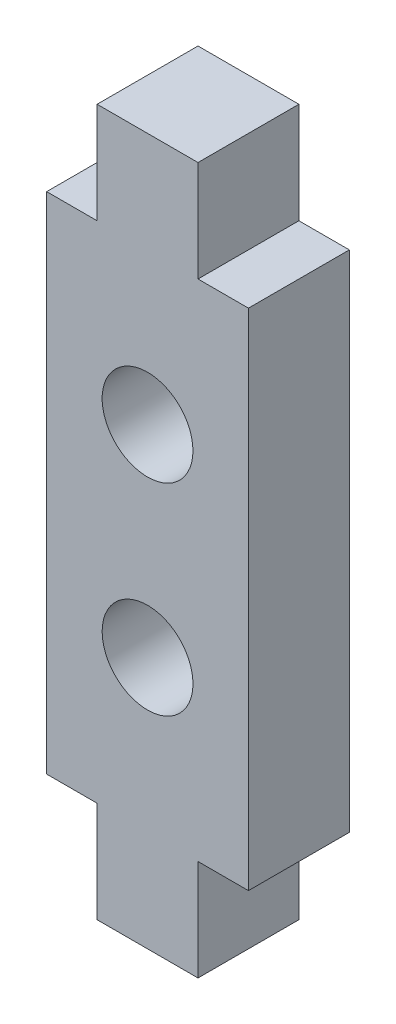
ISO-10303-21;
HEADER;
FILE_DESCRIPTION(('STEP AP214'),'2;1');
FILE_NAME('part.step','',(''),(''),'','','');
FILE_SCHEMA(('AUTOMOTIVE_DESIGN { 1 0 10303 214 1 1 1 1 }'));
ENDSEC;
DATA;
#1=APPLICATION_CONTEXT('core data for automotive mechanical design processes');
#2=APPLICATION_PROTOCOL_DEFINITION('international standard','automotive_design',2000,#1);
#3=PRODUCT_CONTEXT('',#1,'mechanical');
#4=PRODUCT('Part','Part','',(#3));
#5=PRODUCT_RELATED_PRODUCT_CATEGORY('part','',(#4));
#6=PRODUCT_DEFINITION_FORMATION('','',#4);
#7=PRODUCT_DEFINITION_CONTEXT('part definition',#1,'design');
#8=PRODUCT_DEFINITION('design','',#6,#7);
#9=PRODUCT_DEFINITION_SHAPE('','',#8);
#10=(LENGTH_UNIT() NAMED_UNIT(*) SI_UNIT(.MILLI.,.METRE.));
#11=(NAMED_UNIT(*) PLANE_ANGLE_UNIT() SI_UNIT($,.RADIAN.));
#12=(NAMED_UNIT(*) SI_UNIT($,.STERADIAN.) SOLID_ANGLE_UNIT());
#13=UNCERTAINTY_MEASURE_WITH_UNIT(LENGTH_MEASURE(1.E-05),#10,'distance_accuracy_value','');
#14=(GEOMETRIC_REPRESENTATION_CONTEXT(3) GLOBAL_UNCERTAINTY_ASSIGNED_CONTEXT((#13)) GLOBAL_UNIT_ASSIGNED_CONTEXT((#10,
#11,#12)) REPRESENTATION_CONTEXT('',''));
#15=CARTESIAN_POINT('',(0.,0.,0.));
#16=DIRECTION('',(0.,0.,1.));
#17=DIRECTION('',(1.,0.,0.));
#18=AXIS2_PLACEMENT_3D('',#15,#16,#17);
#19=CARTESIAN_POINT('',(0.,0.,5.));
#20=DIRECTION('',(0.,0.,1.));
#21=DIRECTION('',(1.,0.,0.));
#22=AXIS2_PLACEMENT_3D('',#19,#20,#21);
#23=PLANE('',#22);
#24=CARTESIAN_POINT('',(0.,10.,5.));
#25=DIRECTION('',(0.,0.,1.));
#26=DIRECTION('',(1.,0.,0.));
#27=AXIS2_PLACEMENT_3D('',#24,#25,#26);
#28=CIRCLE('',#27,2.25);
#29=CARTESIAN_POINT('',(2.25,10.,5.));
#30=VERTEX_POINT('',#29);
#31=EDGE_CURVE('E158',#30,#30,#28,.T.);
#32=ORIENTED_EDGE('',*,*,#31,.F.);
#33=EDGE_LOOP('',(#32));
#34=FACE_BOUND('',#33,.T.);
#35=DIRECTION('',(0.,1.,0.));
#36=VECTOR('',#35,1.);
#37=CARTESIAN_POINT('',(5.,17.5,5.));
#38=LINE('',#37,#36);
#39=CARTESIAN_POINT('',(5.,-7.5,5.));
#40=VERTEX_POINT('',#39);
#41=CARTESIAN_POINT('',(5.,17.5,5.));
#42=VERTEX_POINT('',#41);
#43=EDGE_CURVE('E177',#40,#42,#38,.T.);
#44=ORIENTED_EDGE('',*,*,#43,.T.);
#45=DIRECTION('',(-1.,0.,0.));
#46=VECTOR('',#45,1.);
#47=CARTESIAN_POINT('',(2.5,17.5,5.));
#48=LINE('',#47,#46);
#49=CARTESIAN_POINT('',(2.5,17.5,5.));
#50=VERTEX_POINT('',#49);
#51=EDGE_CURVE('E105',#42,#50,#48,.T.);
#52=ORIENTED_EDGE('',*,*,#51,.T.);
#53=DIRECTION('',(0.,1.,0.));
#54=VECTOR('',#53,1.);
#55=CARTESIAN_POINT('',(2.5,22.5,5.));
#56=LINE('',#55,#54);
#57=CARTESIAN_POINT('',(2.5,22.5,5.));
#58=VERTEX_POINT('',#57);
#59=EDGE_CURVE('E204',#50,#58,#56,.T.);
#60=ORIENTED_EDGE('',*,*,#59,.T.);
#61=DIRECTION('',(-1.,0.,0.));
#62=VECTOR('',#61,1.);
#63=CARTESIAN_POINT('',(-2.5,22.5,5.));
#64=LINE('',#63,#62);
#65=CARTESIAN_POINT('',(-2.5,22.5,5.));
#66=VERTEX_POINT('',#65);
#67=EDGE_CURVE('E223',#58,#66,#64,.T.);
#68=ORIENTED_EDGE('',*,*,#67,.T.);
#69=DIRECTION('',(0.,-1.,0.));
#70=VECTOR('',#69,1.);
#71=CARTESIAN_POINT('',(-2.5,22.5,5.));
#72=LINE('',#71,#70);
#73=CARTESIAN_POINT('',(-2.5,17.5,5.));
#74=VERTEX_POINT('',#73);
#75=EDGE_CURVE('E220',#66,#74,#72,.T.);
#76=ORIENTED_EDGE('',*,*,#75,.T.);
#77=DIRECTION('',(-1.,0.,0.));
#78=VECTOR('',#77,1.);
#79=CARTESIAN_POINT('',(-5.,17.5,5.));
#80=LINE('',#79,#78);
#81=CARTESIAN_POINT('',(-5.,17.5,5.));
#82=VERTEX_POINT('',#81);
#83=EDGE_CURVE('E222',#74,#82,#80,.T.);
#84=ORIENTED_EDGE('',*,*,#83,.T.);
#85=DIRECTION('',(0.,-1.,0.));
#86=VECTOR('',#85,1.);
#87=CARTESIAN_POINT('',(-5.,17.5,5.));
#88=LINE('',#87,#86);
#89=CARTESIAN_POINT('',(-5.00000000000001,-7.5,5.));
#90=VERTEX_POINT('',#89);
#91=EDGE_CURVE('E225',#82,#90,#88,.T.);
#92=ORIENTED_EDGE('',*,*,#91,.T.);
#93=DIRECTION('',(1.,0.,0.));
#94=VECTOR('',#93,1.);
#95=CARTESIAN_POINT('',(-5.00000000000001,-7.5,5.));
#96=LINE('',#95,#94);
#97=CARTESIAN_POINT('',(-2.5,-7.5,5.));
#98=VERTEX_POINT('',#97);
#99=EDGE_CURVE('E231',#90,#98,#96,.T.);
#100=ORIENTED_EDGE('',*,*,#99,.T.);
#101=DIRECTION('',(0.,-1.,0.));
#102=VECTOR('',#101,1.);
#103=CARTESIAN_POINT('',(-2.5,-12.5,5.));
#104=LINE('',#103,#102);
#105=CARTESIAN_POINT('',(-2.5,-12.5,5.));
#106=VERTEX_POINT('',#105);
#107=EDGE_CURVE('E136',#98,#106,#104,.T.);
#108=ORIENTED_EDGE('',*,*,#107,.T.);
#109=DIRECTION('',(1.,0.,0.));
#110=VECTOR('',#109,1.);
#111=CARTESIAN_POINT('',(-2.5,-12.5,5.));
#112=LINE('',#111,#110);
#113=CARTESIAN_POINT('',(2.5,-12.5,5.));
#114=VERTEX_POINT('',#113);
#115=EDGE_CURVE('E130',#106,#114,#112,.T.);
#116=ORIENTED_EDGE('',*,*,#115,.T.);
#117=DIRECTION('',(0.,1.,0.));
#118=VECTOR('',#117,1.);
#119=CARTESIAN_POINT('',(2.5,-12.5,5.));
#120=LINE('',#119,#118);
#121=CARTESIAN_POINT('',(2.5,-7.5,5.));
#122=VERTEX_POINT('',#121);
#123=EDGE_CURVE('E134',#114,#122,#120,.T.);
#124=ORIENTED_EDGE('',*,*,#123,.T.);
#125=DIRECTION('',(1.,0.,0.));
#126=VECTOR('',#125,1.);
#127=CARTESIAN_POINT('',(2.5,-7.5,5.));
#128=LINE('',#127,#126);
#129=EDGE_CURVE('E50',#122,#40,#128,.T.);
#130=ORIENTED_EDGE('',*,*,#129,.T.);
#131=EDGE_LOOP('',(#44,#52,#60,#68,#76,#84,#92,#100,#108,#116,#124,#130));
#132=FACE_BOUND('',#131,.T.);
#133=CARTESIAN_POINT('',(0.,0.,5.));
#134=DIRECTION('',(0.,0.,1.));
#135=DIRECTION('',(-1.,0.,0.));
#136=AXIS2_PLACEMENT_3D('',#133,#134,#135);
#137=CIRCLE('',#136,2.25);
#138=CARTESIAN_POINT('',(-2.24999999999999,0.,5.));
#139=VERTEX_POINT('',#138);
#140=EDGE_CURVE('E273',#139,#139,#137,.T.);
#141=ORIENTED_EDGE('',*,*,#140,.F.);
#142=EDGE_LOOP('',(#141));
#143=FACE_BOUND('',#142,.T.);
#144=ADVANCED_FACE('F33',(#34,#132,#143),#23,.T.);
#145=CARTESIAN_POINT('',(0.,0.,0.));
#146=DIRECTION('',(0.,0.,1.));
#147=DIRECTION('',(1.,0.,0.));
#148=AXIS2_PLACEMENT_3D('',#145,#146,#147);
#149=PLANE('',#148);
#150=DIRECTION('',(0.,1.,0.));
#151=VECTOR('',#150,1.);
#152=CARTESIAN_POINT('',(5.,17.5,0.));
#153=LINE('',#152,#151);
#154=CARTESIAN_POINT('',(5.,-7.5,0.));
#155=VERTEX_POINT('',#154);
#156=CARTESIAN_POINT('',(5.,17.5,0.));
#157=VERTEX_POINT('',#156);
#158=EDGE_CURVE('E154',#155,#157,#153,.T.);
#159=ORIENTED_EDGE('',*,*,#158,.F.);
#160=DIRECTION('',(1.,0.,0.));
#161=VECTOR('',#160,1.);
#162=CARTESIAN_POINT('',(2.5,-7.5,0.));
#163=LINE('',#162,#161);
#164=CARTESIAN_POINT('',(2.5,-7.5,0.));
#165=VERTEX_POINT('',#164);
#166=EDGE_CURVE('E97',#165,#155,#163,.T.);
#167=ORIENTED_EDGE('',*,*,#166,.F.);
#168=DIRECTION('',(0.,1.,0.));
#169=VECTOR('',#168,1.);
#170=CARTESIAN_POINT('',(2.5,-12.5,0.));
#171=LINE('',#170,#169);
#172=CARTESIAN_POINT('',(2.5,-12.5,0.));
#173=VERTEX_POINT('',#172);
#174=EDGE_CURVE('E91',#173,#165,#171,.T.);
#175=ORIENTED_EDGE('',*,*,#174,.F.);
#176=DIRECTION('',(1.,0.,0.));
#177=VECTOR('',#176,1.);
#178=CARTESIAN_POINT('',(-2.5,-12.5,0.));
#179=LINE('',#178,#177);
#180=CARTESIAN_POINT('',(-2.5,-12.5,0.));
#181=VERTEX_POINT('',#180);
#182=EDGE_CURVE('E144',#181,#173,#179,.T.);
#183=ORIENTED_EDGE('',*,*,#182,.F.);
#184=DIRECTION('',(0.,-1.,0.));
#185=VECTOR('',#184,1.);
#186=CARTESIAN_POINT('',(-2.5,-12.5,0.));
#187=LINE('',#186,#185);
#188=CARTESIAN_POINT('',(-2.5,-7.5,0.));
#189=VERTEX_POINT('',#188);
#190=EDGE_CURVE('E172',#189,#181,#187,.T.);
#191=ORIENTED_EDGE('',*,*,#190,.F.);
#192=DIRECTION('',(1.,0.,0.));
#193=VECTOR('',#192,1.);
#194=CARTESIAN_POINT('',(-5.00000000000001,-7.5,0.));
#195=LINE('',#194,#193);
#196=CARTESIAN_POINT('',(-5.00000000000001,-7.5,0.));
#197=VERTEX_POINT('',#196);
#198=EDGE_CURVE('E170',#197,#189,#195,.T.);
#199=ORIENTED_EDGE('',*,*,#198,.F.);
#200=DIRECTION('',(0.,-1.,0.));
#201=VECTOR('',#200,1.);
#202=CARTESIAN_POINT('',(-5.,17.5,0.));
#203=LINE('',#202,#201);
#204=CARTESIAN_POINT('',(-5.,17.5,0.));
#205=VERTEX_POINT('',#204);
#206=EDGE_CURVE('E168',#205,#197,#203,.T.);
#207=ORIENTED_EDGE('',*,*,#206,.F.);
#208=DIRECTION('',(-1.,0.,0.));
#209=VECTOR('',#208,1.);
#210=CARTESIAN_POINT('',(-5.,17.5,0.));
#211=LINE('',#210,#209);
#212=CARTESIAN_POINT('',(-2.5,17.5,0.));
#213=VERTEX_POINT('',#212);
#214=EDGE_CURVE('E166',#213,#205,#211,.T.);
#215=ORIENTED_EDGE('',*,*,#214,.F.);
#216=DIRECTION('',(0.,-1.,0.));
#217=VECTOR('',#216,1.);
#218=CARTESIAN_POINT('',(-2.5,22.5,0.));
#219=LINE('',#218,#217);
#220=CARTESIAN_POINT('',(-2.5,22.5,0.));
#221=VERTEX_POINT('',#220);
#222=EDGE_CURVE('E164',#221,#213,#219,.T.);
#223=ORIENTED_EDGE('',*,*,#222,.F.);
#224=DIRECTION('',(-1.,0.,0.));
#225=VECTOR('',#224,1.);
#226=CARTESIAN_POINT('',(-2.5,22.5,0.));
#227=LINE('',#226,#225);
#228=CARTESIAN_POINT('',(2.5,22.5,0.));
#229=VERTEX_POINT('',#228);
#230=EDGE_CURVE('E162',#229,#221,#227,.T.);
#231=ORIENTED_EDGE('',*,*,#230,.F.);
#232=DIRECTION('',(0.,1.,0.));
#233=VECTOR('',#232,1.);
#234=CARTESIAN_POINT('',(2.5,22.5,0.));
#235=LINE('',#234,#233);
#236=CARTESIAN_POINT('',(2.5,17.5,0.));
#237=VERTEX_POINT('',#236);
#238=EDGE_CURVE('E160',#237,#229,#235,.T.);
#239=ORIENTED_EDGE('',*,*,#238,.F.);
#240=DIRECTION('',(-1.,0.,0.));
#241=VECTOR('',#240,1.);
#242=CARTESIAN_POINT('',(2.5,17.5,0.));
#243=LINE('',#242,#241);
#244=EDGE_CURVE('E157',#157,#237,#243,.T.);
#245=ORIENTED_EDGE('',*,*,#244,.F.);
#246=EDGE_LOOP('',(#159,#167,#175,#183,#191,#199,#207,#215,#223,#231,#239,#245));
#247=FACE_BOUND('',#246,.T.);
#248=CARTESIAN_POINT('',(0.,10.,0.));
#249=DIRECTION('',(0.,0.,1.));
#250=DIRECTION('',(1.,0.,0.));
#251=AXIS2_PLACEMENT_3D('',#248,#249,#250);
#252=CIRCLE('',#251,2.25);
#253=CARTESIAN_POINT('',(2.25,10.,0.));
#254=VERTEX_POINT('',#253);
#255=EDGE_CURVE('E279',#254,#254,#252,.T.);
#256=ORIENTED_EDGE('',*,*,#255,.T.);
#257=EDGE_LOOP('',(#256));
#258=FACE_BOUND('',#257,.T.);
#259=CARTESIAN_POINT('',(0.,0.,0.));
#260=DIRECTION('',(0.,0.,1.));
#261=DIRECTION('',(-1.,0.,0.));
#262=AXIS2_PLACEMENT_3D('',#259,#260,#261);
#263=CIRCLE('',#262,2.25);
#264=CARTESIAN_POINT('',(-2.24999999999999,0.,0.));
#265=VERTEX_POINT('',#264);
#266=EDGE_CURVE('E276',#265,#265,#263,.T.);
#267=ORIENTED_EDGE('',*,*,#266,.T.);
#268=EDGE_LOOP('',(#267));
#269=FACE_BOUND('',#268,.T.);
#270=ADVANCED_FACE('F208',(#247,#258,#269),#149,.F.);
#271=CARTESIAN_POINT('',(5.,17.5,5.));
#272=DIRECTION('',(-1.,0.,0.));
#273=DIRECTION('',(0.,-1.,0.));
#274=AXIS2_PLACEMENT_3D('',#271,#272,#273);
#275=PLANE('',#274);
#276=ORIENTED_EDGE('',*,*,#158,.T.);
#277=DIRECTION('',(0.,0.,-1.));
#278=VECTOR('',#277,1.);
#279=CARTESIAN_POINT('',(5.,17.5,5.));
#280=LINE('',#279,#278);
#281=EDGE_CURVE('E11',#42,#157,#280,.T.);
#282=ORIENTED_EDGE('',*,*,#281,.F.);
#283=ORIENTED_EDGE('',*,*,#43,.F.);
#284=DIRECTION('',(0.,0.,-1.));
#285=VECTOR('',#284,1.);
#286=CARTESIAN_POINT('',(5.,-7.5,5.));
#287=LINE('',#286,#285);
#288=EDGE_CURVE('E150',#40,#155,#287,.T.);
#289=ORIENTED_EDGE('',*,*,#288,.T.);
#290=EDGE_LOOP('',(#276,#282,#283,#289));
#291=FACE_BOUND('',#290,.T.);
#292=ADVANCED_FACE('F35',(#291),#275,.F.);
#293=CARTESIAN_POINT('',(2.5,17.5,5.));
#294=DIRECTION('',(0.,-1.,0.));
#295=DIRECTION('',(1.,0.,0.));
#296=AXIS2_PLACEMENT_3D('',#293,#294,#295);
#297=PLANE('',#296);
#298=ORIENTED_EDGE('',*,*,#244,.T.);
#299=DIRECTION('',(0.,0.,-1.));
#300=VECTOR('',#299,1.);
#301=CARTESIAN_POINT('',(2.5,17.5,5.));
#302=LINE('',#301,#300);
#303=EDGE_CURVE('E42',#50,#237,#302,.T.);
#304=ORIENTED_EDGE('',*,*,#303,.F.);
#305=ORIENTED_EDGE('',*,*,#51,.F.);
#306=ORIENTED_EDGE('',*,*,#281,.T.);
#307=EDGE_LOOP('',(#298,#304,#305,#306));
#308=FACE_BOUND('',#307,.T.);
#309=ADVANCED_FACE('F372',(#308),#297,.F.);
#310=CARTESIAN_POINT('',(2.5,22.5,5.));
#311=DIRECTION('',(-1.,0.,0.));
#312=DIRECTION('',(0.,-1.,0.));
#313=AXIS2_PLACEMENT_3D('',#310,#311,#312);
#314=PLANE('',#313);
#315=ORIENTED_EDGE('',*,*,#238,.T.);
#316=DIRECTION('',(0.,0.,-1.));
#317=VECTOR('',#316,1.);
#318=CARTESIAN_POINT('',(2.5,22.5,5.));
#319=LINE('',#318,#317);
#320=EDGE_CURVE('E196',#58,#229,#319,.T.);
#321=ORIENTED_EDGE('',*,*,#320,.F.);
#322=ORIENTED_EDGE('',*,*,#59,.F.);
#323=ORIENTED_EDGE('',*,*,#303,.T.);
#324=EDGE_LOOP('',(#315,#321,#322,#323));
#325=FACE_BOUND('',#324,.T.);
#326=ADVANCED_FACE('F202',(#325),#314,.F.);
#327=CARTESIAN_POINT('',(-2.5,22.5,5.));
#328=DIRECTION('',(0.,-1.,0.));
#329=DIRECTION('',(0.,0.,-1.));
#330=AXIS2_PLACEMENT_3D('',#327,#328,#329);
#331=PLANE('',#330);
#332=ORIENTED_EDGE('',*,*,#230,.T.);
#333=DIRECTION('',(0.,0.,-1.));
#334=VECTOR('',#333,1.);
#335=CARTESIAN_POINT('',(-2.5,22.5,5.));
#336=LINE('',#335,#334);
#337=EDGE_CURVE('E193',#66,#221,#336,.T.);
#338=ORIENTED_EDGE('',*,*,#337,.F.);
#339=ORIENTED_EDGE('',*,*,#67,.F.);
#340=ORIENTED_EDGE('',*,*,#320,.T.);
#341=EDGE_LOOP('',(#332,#338,#339,#340));
#342=FACE_BOUND('',#341,.T.);
#343=ADVANCED_FACE('F214',(#342),#331,.F.);
#344=CARTESIAN_POINT('',(-2.5,22.5,5.));
#345=DIRECTION('',(1.,0.,0.));
#346=DIRECTION('',(0.,1.,0.));
#347=AXIS2_PLACEMENT_3D('',#344,#345,#346);
#348=PLANE('',#347);
#349=ORIENTED_EDGE('',*,*,#222,.T.);
#350=DIRECTION('',(0.,0.,-1.));
#351=VECTOR('',#350,1.);
#352=CARTESIAN_POINT('',(-2.5,17.5,5.));
#353=LINE('',#352,#351);
#354=EDGE_CURVE('E190',#74,#213,#353,.T.);
#355=ORIENTED_EDGE('',*,*,#354,.F.);
#356=ORIENTED_EDGE('',*,*,#75,.F.);
#357=ORIENTED_EDGE('',*,*,#337,.T.);
#358=EDGE_LOOP('',(#349,#355,#356,#357));
#359=FACE_BOUND('',#358,.T.);
#360=ADVANCED_FACE('F218',(#359),#348,.F.);
#361=CARTESIAN_POINT('',(-5.,17.5,5.));
#362=DIRECTION('',(0.,-1.,0.));
#363=DIRECTION('',(1.,0.,0.));
#364=AXIS2_PLACEMENT_3D('',#361,#362,#363);
#365=PLANE('',#364);
#366=ORIENTED_EDGE('',*,*,#214,.T.);
#367=DIRECTION('',(0.,0.,-1.));
#368=VECTOR('',#367,1.);
#369=CARTESIAN_POINT('',(-5.,17.5,5.));
#370=LINE('',#369,#368);
#371=EDGE_CURVE('E187',#82,#205,#370,.T.);
#372=ORIENTED_EDGE('',*,*,#371,.F.);
#373=ORIENTED_EDGE('',*,*,#83,.F.);
#374=ORIENTED_EDGE('',*,*,#354,.T.);
#375=EDGE_LOOP('',(#366,#372,#373,#374));
#376=FACE_BOUND('',#375,.T.);
#377=ADVANCED_FACE('F337',(#376),#365,.F.);
#378=CARTESIAN_POINT('',(-5.,17.5,5.));
#379=DIRECTION('',(1.,0.,0.));
#380=DIRECTION('',(0.,1.,0.));
#381=AXIS2_PLACEMENT_3D('',#378,#379,#380);
#382=PLANE('',#381);
#383=ORIENTED_EDGE('',*,*,#206,.T.);
#384=DIRECTION('',(0.,0.,-1.));
#385=VECTOR('',#384,1.);
#386=CARTESIAN_POINT('',(-5.00000000000001,-7.5,5.));
#387=LINE('',#386,#385);
#388=EDGE_CURVE('E184',#90,#197,#387,.T.);
#389=ORIENTED_EDGE('',*,*,#388,.F.);
#390=ORIENTED_EDGE('',*,*,#91,.F.);
#391=ORIENTED_EDGE('',*,*,#371,.T.);
#392=EDGE_LOOP('',(#383,#389,#390,#391));
#393=FACE_BOUND('',#392,.T.);
#394=ADVANCED_FACE('F328',(#393),#382,.F.);
#395=CARTESIAN_POINT('',(-5.00000000000001,-7.5,5.));
#396=DIRECTION('',(0.,1.,0.));
#397=DIRECTION('',(0.,0.,1.));
#398=AXIS2_PLACEMENT_3D('',#395,#396,#397);
#399=PLANE('',#398);
#400=ORIENTED_EDGE('',*,*,#198,.T.);
#401=DIRECTION('',(0.,0.,-1.));
#402=VECTOR('',#401,1.);
#403=CARTESIAN_POINT('',(-2.5,-7.5,5.));
#404=LINE('',#403,#402);
#405=EDGE_CURVE('E181',#98,#189,#404,.T.);
#406=ORIENTED_EDGE('',*,*,#405,.F.);
#407=ORIENTED_EDGE('',*,*,#99,.F.);
#408=ORIENTED_EDGE('',*,*,#388,.T.);
#409=EDGE_LOOP('',(#400,#406,#407,#408));
#410=FACE_BOUND('',#409,.T.);
#411=ADVANCED_FACE('F237',(#410),#399,.F.);
#412=CARTESIAN_POINT('',(-2.5,-12.5,5.));
#413=DIRECTION('',(1.,0.,0.));
#414=DIRECTION('',(0.,0.,-1.));
#415=AXIS2_PLACEMENT_3D('',#412,#413,#414);
#416=PLANE('',#415);
#417=ORIENTED_EDGE('',*,*,#190,.T.);
#418=DIRECTION('',(0.,0.,-1.));
#419=VECTOR('',#418,1.);
#420=CARTESIAN_POINT('',(-2.5,-12.5,5.));
#421=LINE('',#420,#419);
#422=EDGE_CURVE('E145',#106,#181,#421,.T.);
#423=ORIENTED_EDGE('',*,*,#422,.F.);
#424=ORIENTED_EDGE('',*,*,#107,.F.);
#425=ORIENTED_EDGE('',*,*,#405,.T.);
#426=EDGE_LOOP('',(#417,#423,#424,#425));
#427=FACE_BOUND('',#426,.T.);
#428=ADVANCED_FACE('F241',(#427),#416,.F.);
#429=CARTESIAN_POINT('',(-2.5,-12.5,5.));
#430=DIRECTION('',(0.,1.,0.));
#431=DIRECTION('',(0.,0.,1.));
#432=AXIS2_PLACEMENT_3D('',#429,#430,#431);
#433=PLANE('',#432);
#434=ORIENTED_EDGE('',*,*,#182,.T.);
#435=DIRECTION('',(0.,0.,-1.));
#436=VECTOR('',#435,1.);
#437=CARTESIAN_POINT('',(2.5,-12.5,5.));
#438=LINE('',#437,#436);
#439=EDGE_CURVE('E141',#114,#173,#438,.T.);
#440=ORIENTED_EDGE('',*,*,#439,.F.);
#441=ORIENTED_EDGE('',*,*,#115,.F.);
#442=ORIENTED_EDGE('',*,*,#422,.T.);
#443=EDGE_LOOP('',(#434,#440,#441,#442));
#444=FACE_BOUND('',#443,.T.);
#445=ADVANCED_FACE('F142',(#444),#433,.F.);
#446=CARTESIAN_POINT('',(2.5,-12.5,5.));
#447=DIRECTION('',(-1.,0.,0.));
#448=DIRECTION('',(0.,-1.,0.));
#449=AXIS2_PLACEMENT_3D('',#446,#447,#448);
#450=PLANE('',#449);
#451=ORIENTED_EDGE('',*,*,#174,.T.);
#452=DIRECTION('',(0.,0.,-1.));
#453=VECTOR('',#452,1.);
#454=CARTESIAN_POINT('',(2.5,-7.5,5.));
#455=LINE('',#454,#453);
#456=EDGE_CURVE('E146',#122,#165,#455,.T.);
#457=ORIENTED_EDGE('',*,*,#456,.F.);
#458=ORIENTED_EDGE('',*,*,#123,.F.);
#459=ORIENTED_EDGE('',*,*,#439,.T.);
#460=EDGE_LOOP('',(#451,#457,#458,#459));
#461=FACE_BOUND('',#460,.T.);
#462=ADVANCED_FACE('F148',(#461),#450,.F.);
#463=CARTESIAN_POINT('',(2.5,-7.5,5.));
#464=DIRECTION('',(0.,1.,0.));
#465=DIRECTION('',(0.,0.,1.));
#466=AXIS2_PLACEMENT_3D('',#463,#464,#465);
#467=PLANE('',#466);
#468=ORIENTED_EDGE('',*,*,#166,.T.);
#469=ORIENTED_EDGE('',*,*,#288,.F.);
#470=ORIENTED_EDGE('',*,*,#129,.F.);
#471=ORIENTED_EDGE('',*,*,#456,.T.);
#472=EDGE_LOOP('',(#468,#469,#470,#471));
#473=FACE_BOUND('',#472,.T.);
#474=ADVANCED_FACE('F245',(#473),#467,.F.);
#475=CARTESIAN_POINT('',(0.,10.,5.));
#476=DIRECTION('',(0.,0.,-1.));
#477=DIRECTION('',(-1.,0.,0.));
#478=AXIS2_PLACEMENT_3D('',#475,#476,#477);
#479=CYLINDRICAL_SURFACE('',#478,2.25);
#480=ORIENTED_EDGE('',*,*,#31,.T.);
#481=EDGE_LOOP('',(#480));
#482=FACE_BOUND('',#481,.T.);
#483=ORIENTED_EDGE('',*,*,#255,.F.);
#484=EDGE_LOOP('',(#483));
#485=FACE_BOUND('',#484,.T.);
#486=ADVANCED_FACE('F247',(#482,#485),#479,.F.);
#487=CARTESIAN_POINT('',(0.,0.,5.));
#488=DIRECTION('',(0.,0.,-1.));
#489=DIRECTION('',(-1.,0.,0.));
#490=AXIS2_PLACEMENT_3D('',#487,#488,#489);
#491=CYLINDRICAL_SURFACE('',#490,2.25);
#492=ORIENTED_EDGE('',*,*,#140,.T.);
#493=EDGE_LOOP('',(#492));
#494=FACE_BOUND('',#493,.T.);
#495=ORIENTED_EDGE('',*,*,#266,.F.);
#496=EDGE_LOOP('',(#495));
#497=FACE_BOUND('',#496,.T.);
#498=ADVANCED_FACE('F253',(#494,#497),#491,.F.);
#499=CLOSED_SHELL('',(#144,#270,#292,#309,#326,#343,#360,#377,#394,#411,#428,#445,#462,#474,
#486,#498));
#500=MANIFOLD_SOLID_BREP('B2',#499);
#501=ADVANCED_BREP_SHAPE_REPRESENTATION('',(#18,#500),#14);
#502=SHAPE_DEFINITION_REPRESENTATION(#9,#501);
ENDSEC;
END-ISO-10303-21;
